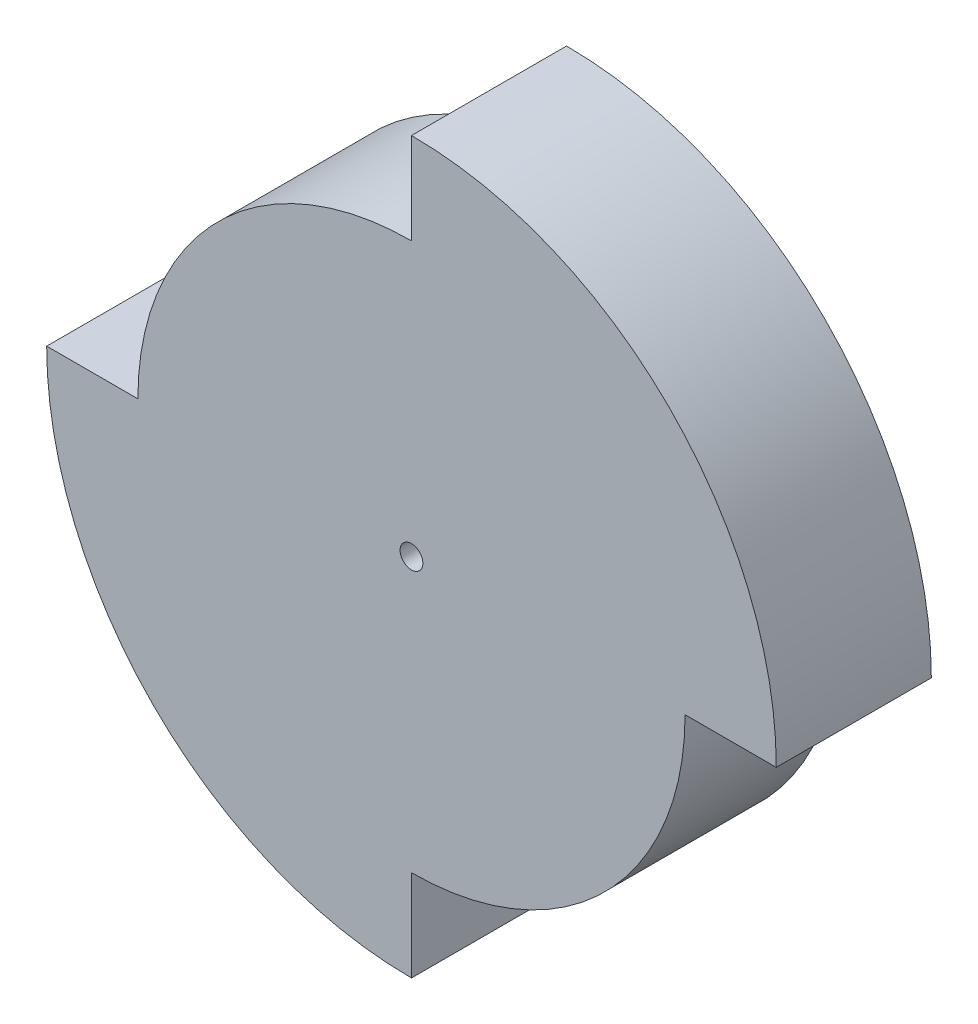
ISO-10303-21;
HEADER;
FILE_DESCRIPTION(('STEP AP214'),'2;1');
FILE_NAME('part.step','',(''),(''),'','','');
FILE_SCHEMA(('AUTOMOTIVE_DESIGN { 1 0 10303 214 1 1 1 1 }'));
ENDSEC;
DATA;
#1=APPLICATION_CONTEXT('core data for automotive mechanical design processes');
#2=APPLICATION_PROTOCOL_DEFINITION('international standard','automotive_design',2000,#1);
#3=PRODUCT_CONTEXT('',#1,'mechanical');
#4=PRODUCT('Part','Part','',(#3));
#5=PRODUCT_RELATED_PRODUCT_CATEGORY('part','',(#4));
#6=PRODUCT_DEFINITION_FORMATION('','',#4);
#7=PRODUCT_DEFINITION_CONTEXT('part definition',#1,'design');
#8=PRODUCT_DEFINITION('design','',#6,#7);
#9=PRODUCT_DEFINITION_SHAPE('','',#8);
#10=(LENGTH_UNIT() NAMED_UNIT(*) SI_UNIT(.MILLI.,.METRE.));
#11=(NAMED_UNIT(*) PLANE_ANGLE_UNIT() SI_UNIT($,.RADIAN.));
#12=(NAMED_UNIT(*) SI_UNIT($,.STERADIAN.) SOLID_ANGLE_UNIT());
#13=UNCERTAINTY_MEASURE_WITH_UNIT(LENGTH_MEASURE(1.E-05),#10,'distance_accuracy_value','');
#14=(GEOMETRIC_REPRESENTATION_CONTEXT(3) GLOBAL_UNCERTAINTY_ASSIGNED_CONTEXT((#13)) GLOBAL_UNIT_ASSIGNED_CONTEXT((#10,
#11,#12)) REPRESENTATION_CONTEXT('',''));
#15=CARTESIAN_POINT('',(0.,0.,0.));
#16=DIRECTION('',(0.,0.,1.));
#17=DIRECTION('',(1.,0.,0.));
#18=AXIS2_PLACEMENT_3D('',#15,#16,#17);
#19=CARTESIAN_POINT('',(0.,0.,17.));
#20=DIRECTION('',(0.,0.,-1.));
#21=DIRECTION('',(-1.,0.,0.));
#22=AXIS2_PLACEMENT_3D('',#19,#20,#21);
#23=CYLINDRICAL_SURFACE('',#22,30.);
#24=CARTESIAN_POINT('',(0.,0.,0.));
#25=DIRECTION('',(0.,0.,1.));
#26=DIRECTION('',(1.,0.,0.));
#27=AXIS2_PLACEMENT_3D('',#24,#25,#26);
#28=CIRCLE('',#27,30.);
#29=CARTESIAN_POINT('',(0.,30.,0.));
#30=VERTEX_POINT('',#29);
#31=CARTESIAN_POINT('',(-30.,0.,0.));
#32=VERTEX_POINT('',#31);
#33=EDGE_CURVE('E135',#30,#32,#28,.T.);
#34=ORIENTED_EDGE('',*,*,#33,.T.);
#35=DIRECTION('',(0.,0.,-1.));
#36=VECTOR('',#35,1.);
#37=CARTESIAN_POINT('',(-30.,0.,17.));
#38=LINE('',#37,#36);
#39=CARTESIAN_POINT('',(-30.,0.,17.));
#40=VERTEX_POINT('',#39);
#41=EDGE_CURVE('E11',#40,#32,#38,.T.);
#42=ORIENTED_EDGE('',*,*,#41,.F.);
#43=CARTESIAN_POINT('',(0.,0.,17.));
#44=DIRECTION('',(0.,0.,1.));
#45=DIRECTION('',(1.,0.,0.));
#46=AXIS2_PLACEMENT_3D('',#43,#44,#45);
#47=CIRCLE('',#46,30.);
#48=CARTESIAN_POINT('',(0.,30.,17.));
#49=VERTEX_POINT('',#48);
#50=EDGE_CURVE('E152',#49,#40,#47,.T.);
#51=ORIENTED_EDGE('',*,*,#50,.F.);
#52=DIRECTION('',(0.,0.,-1.));
#53=VECTOR('',#52,1.);
#54=CARTESIAN_POINT('',(0.,30.,17.));
#55=LINE('',#54,#53);
#56=EDGE_CURVE('E53',#49,#30,#55,.T.);
#57=ORIENTED_EDGE('',*,*,#56,.T.);
#58=EDGE_LOOP('',(#34,#42,#51,#57));
#59=FACE_BOUND('',#58,.T.);
#60=ADVANCED_FACE('F35',(#59),#23,.T.);
#61=CARTESIAN_POINT('',(0.,0.,17.));
#62=DIRECTION('',(0.,-1.,0.));
#63=DIRECTION('',(1.,0.,0.));
#64=AXIS2_PLACEMENT_3D('',#61,#62,#63);
#65=PLANE('',#64);
#66=DIRECTION('',(-1.,0.,0.));
#67=VECTOR('',#66,1.);
#68=CARTESIAN_POINT('',(0.,0.,0.));
#69=LINE('',#68,#67);
#70=CARTESIAN_POINT('',(-40.,0.,0.));
#71=VERTEX_POINT('',#70);
#72=EDGE_CURVE('E137',#32,#71,#69,.T.);
#73=ORIENTED_EDGE('',*,*,#72,.T.);
#74=DIRECTION('',(0.,0.,-1.));
#75=VECTOR('',#74,1.);
#76=CARTESIAN_POINT('',(-40.,0.,17.));
#77=LINE('',#76,#75);
#78=CARTESIAN_POINT('',(-40.,0.,17.));
#79=VERTEX_POINT('',#78);
#80=EDGE_CURVE('E45',#79,#71,#77,.T.);
#81=ORIENTED_EDGE('',*,*,#80,.F.);
#82=DIRECTION('',(-1.,0.,0.));
#83=VECTOR('',#82,1.);
#84=CARTESIAN_POINT('',(0.,0.,17.));
#85=LINE('',#84,#83);
#86=EDGE_CURVE('E91',#40,#79,#85,.T.);
#87=ORIENTED_EDGE('',*,*,#86,.F.);
#88=ORIENTED_EDGE('',*,*,#41,.T.);
#89=EDGE_LOOP('',(#73,#81,#87,#88));
#90=FACE_BOUND('',#89,.T.);
#91=ADVANCED_FACE('F37',(#90),#65,.F.);
#92=CARTESIAN_POINT('',(0.,0.,17.));
#93=DIRECTION('',(0.,0.,-1.));
#94=DIRECTION('',(-1.,0.,0.));
#95=AXIS2_PLACEMENT_3D('',#92,#93,#94);
#96=CYLINDRICAL_SURFACE('',#95,40.);
#97=CARTESIAN_POINT('',(0.,0.,0.));
#98=DIRECTION('',(0.,0.,1.));
#99=DIRECTION('',(1.,0.,0.));
#100=AXIS2_PLACEMENT_3D('',#97,#98,#99);
#101=CIRCLE('',#100,40.);
#102=CARTESIAN_POINT('',(0.,-40.,0.));
#103=VERTEX_POINT('',#102);
#104=EDGE_CURVE('E140',#71,#103,#101,.T.);
#105=ORIENTED_EDGE('',*,*,#104,.T.);
#106=DIRECTION('',(0.,0.,-1.));
#107=VECTOR('',#106,1.);
#108=CARTESIAN_POINT('',(0.,-40.,17.));
#109=LINE('',#108,#107);
#110=CARTESIAN_POINT('',(0.,-40.,17.));
#111=VERTEX_POINT('',#110);
#112=EDGE_CURVE('E158',#111,#103,#109,.T.);
#113=ORIENTED_EDGE('',*,*,#112,.F.);
#114=CARTESIAN_POINT('',(0.,0.,17.));
#115=DIRECTION('',(0.,0.,1.));
#116=DIRECTION('',(1.,0.,0.));
#117=AXIS2_PLACEMENT_3D('',#114,#115,#116);
#118=CIRCLE('',#117,40.);
#119=EDGE_CURVE('E166',#79,#111,#118,.T.);
#120=ORIENTED_EDGE('',*,*,#119,.F.);
#121=ORIENTED_EDGE('',*,*,#80,.T.);
#122=EDGE_LOOP('',(#105,#113,#120,#121));
#123=FACE_BOUND('',#122,.T.);
#124=ADVANCED_FACE('F164',(#123),#96,.T.);
#125=CARTESIAN_POINT('',(0.,0.,17.));
#126=DIRECTION('',(1.,0.,0.));
#127=DIRECTION('',(0.,1.,0.));
#128=AXIS2_PLACEMENT_3D('',#125,#126,#127);
#129=PLANE('',#128);
#130=DIRECTION('',(0.,-1.,0.));
#131=VECTOR('',#130,1.);
#132=CARTESIAN_POINT('',(0.,0.,0.));
#133=LINE('',#132,#131);
#134=CARTESIAN_POINT('',(0.,-30.,0.));
#135=VERTEX_POINT('',#134);
#136=EDGE_CURVE('E143',#135,#103,#133,.T.);
#137=ORIENTED_EDGE('',*,*,#136,.F.);
#138=DIRECTION('',(0.,0.,-1.));
#139=VECTOR('',#138,1.);
#140=CARTESIAN_POINT('',(0.,-30.,17.));
#141=LINE('',#140,#139);
#142=CARTESIAN_POINT('',(0.,-30.,17.));
#143=VERTEX_POINT('',#142);
#144=EDGE_CURVE('E156',#143,#135,#141,.T.);
#145=ORIENTED_EDGE('',*,*,#144,.F.);
#146=DIRECTION('',(0.,-1.,0.));
#147=VECTOR('',#146,1.);
#148=CARTESIAN_POINT('',(0.,0.,17.));
#149=LINE('',#148,#147);
#150=EDGE_CURVE('E174',#143,#111,#149,.T.);
#151=ORIENTED_EDGE('',*,*,#150,.T.);
#152=ORIENTED_EDGE('',*,*,#112,.T.);
#153=EDGE_LOOP('',(#137,#145,#151,#152));
#154=FACE_BOUND('',#153,.T.);
#155=ADVANCED_FACE('F172',(#154),#129,.T.);
#156=CARTESIAN_POINT('',(30.,0.,0.));
#157=VERTEX_POINT('',#156);
#158=EDGE_CURVE('E138',#135,#157,#28,.T.);
#159=ORIENTED_EDGE('',*,*,#158,.T.);
#160=DIRECTION('',(0.,0.,-1.));
#161=VECTOR('',#160,1.);
#162=CARTESIAN_POINT('',(30.,0.,17.));
#163=LINE('',#162,#161);
#164=CARTESIAN_POINT('',(30.,0.,17.));
#165=VERTEX_POINT('',#164);
#166=EDGE_CURVE('E127',#165,#157,#163,.T.);
#167=ORIENTED_EDGE('',*,*,#166,.F.);
#168=EDGE_CURVE('E115',#143,#165,#47,.T.);
#169=ORIENTED_EDGE('',*,*,#168,.F.);
#170=ORIENTED_EDGE('',*,*,#144,.T.);
#171=EDGE_LOOP('',(#159,#167,#169,#170));
#172=FACE_BOUND('',#171,.T.);
#173=ADVANCED_FACE('F197',(#172),#23,.T.);
#174=CARTESIAN_POINT('',(0.,0.,17.));
#175=DIRECTION('',(0.,1.,0.));
#176=DIRECTION('',(-1.,0.,0.));
#177=AXIS2_PLACEMENT_3D('',#174,#175,#176);
#178=PLANE('',#177);
#179=DIRECTION('',(1.,0.,0.));
#180=VECTOR('',#179,1.);
#181=CARTESIAN_POINT('',(0.,0.,0.));
#182=LINE('',#181,#180);
#183=CARTESIAN_POINT('',(40.,0.,0.));
#184=VERTEX_POINT('',#183);
#185=EDGE_CURVE('E124',#157,#184,#182,.T.);
#186=ORIENTED_EDGE('',*,*,#185,.T.);
#187=DIRECTION('',(0.,0.,-1.));
#188=VECTOR('',#187,1.);
#189=CARTESIAN_POINT('',(40.,0.,17.));
#190=LINE('',#189,#188);
#191=CARTESIAN_POINT('',(40.,0.,17.));
#192=VERTEX_POINT('',#191);
#193=EDGE_CURVE('E121',#192,#184,#190,.T.);
#194=ORIENTED_EDGE('',*,*,#193,.F.);
#195=DIRECTION('',(1.,0.,0.));
#196=VECTOR('',#195,1.);
#197=CARTESIAN_POINT('',(0.,0.,17.));
#198=LINE('',#197,#196);
#199=EDGE_CURVE('E107',#165,#192,#198,.T.);
#200=ORIENTED_EDGE('',*,*,#199,.F.);
#201=ORIENTED_EDGE('',*,*,#166,.T.);
#202=EDGE_LOOP('',(#186,#194,#200,#201));
#203=FACE_BOUND('',#202,.T.);
#204=ADVANCED_FACE('F122',(#203),#178,.F.);
#205=CARTESIAN_POINT('',(0.,0.,17.));
#206=DIRECTION('',(0.,0.,-1.));
#207=DIRECTION('',(-1.,0.,0.));
#208=AXIS2_PLACEMENT_3D('',#205,#206,#207);
#209=CYLINDRICAL_SURFACE('',#208,40.);
#210=CARTESIAN_POINT('',(0.,0.,0.));
#211=DIRECTION('',(0.,0.,1.));
#212=DIRECTION('',(1.,0.,0.));
#213=AXIS2_PLACEMENT_3D('',#210,#211,#212);
#214=CIRCLE('',#213,40.);
#215=CARTESIAN_POINT('',(0.,40.,0.));
#216=VERTEX_POINT('',#215);
#217=EDGE_CURVE('E147',#216,#184,#214,.F.);
#218=ORIENTED_EDGE('',*,*,#217,.F.);
#219=DIRECTION('',(0.,0.,-1.));
#220=VECTOR('',#219,1.);
#221=CARTESIAN_POINT('',(0.,40.,17.));
#222=LINE('',#221,#220);
#223=CARTESIAN_POINT('',(0.,40.,17.));
#224=VERTEX_POINT('',#223);
#225=EDGE_CURVE('E79',#224,#216,#222,.T.);
#226=ORIENTED_EDGE('',*,*,#225,.F.);
#227=CARTESIAN_POINT('',(0.,0.,17.));
#228=DIRECTION('',(0.,0.,1.));
#229=DIRECTION('',(1.,0.,0.));
#230=AXIS2_PLACEMENT_3D('',#227,#228,#229);
#231=CIRCLE('',#230,40.);
#232=EDGE_CURVE('E112',#224,#192,#231,.F.);
#233=ORIENTED_EDGE('',*,*,#232,.T.);
#234=ORIENTED_EDGE('',*,*,#193,.T.);
#235=EDGE_LOOP('',(#218,#226,#233,#234));
#236=FACE_BOUND('',#235,.T.);
#237=ADVANCED_FACE('F129',(#236),#209,.T.);
#238=CARTESIAN_POINT('',(0.,0.,17.));
#239=DIRECTION('',(-1.,0.,0.));
#240=DIRECTION('',(0.,-1.,0.));
#241=AXIS2_PLACEMENT_3D('',#238,#239,#240);
#242=PLANE('',#241);
#243=DIRECTION('',(0.,1.,0.));
#244=VECTOR('',#243,1.);
#245=CARTESIAN_POINT('',(0.,0.,0.));
#246=LINE('',#245,#244);
#247=EDGE_CURVE('E149',#30,#216,#246,.T.);
#248=ORIENTED_EDGE('',*,*,#247,.F.);
#249=ORIENTED_EDGE('',*,*,#56,.F.);
#250=DIRECTION('',(0.,1.,0.));
#251=VECTOR('',#250,1.);
#252=CARTESIAN_POINT('',(0.,0.,17.));
#253=LINE('',#252,#251);
#254=EDGE_CURVE('E130',#49,#224,#253,.T.);
#255=ORIENTED_EDGE('',*,*,#254,.T.);
#256=ORIENTED_EDGE('',*,*,#225,.T.);
#257=EDGE_LOOP('',(#248,#249,#255,#256));
#258=FACE_BOUND('',#257,.T.);
#259=ADVANCED_FACE('F209',(#258),#242,.T.);
#260=CARTESIAN_POINT('',(0.,0.,17.));
#261=DIRECTION('',(0.,0.,1.));
#262=DIRECTION('',(1.,0.,0.));
#263=AXIS2_PLACEMENT_3D('',#260,#261,#262);
#264=PLANE('',#263);
#265=CARTESIAN_POINT('',(0.,0.,17.));
#266=DIRECTION('',(0.,0.,1.));
#267=DIRECTION('',(1.,0.,0.));
#268=AXIS2_PLACEMENT_3D('',#265,#266,#267);
#269=CIRCLE('',#268,1.25);
#270=CARTESIAN_POINT('',(1.25,0.,17.));
#271=VERTEX_POINT('',#270);
#272=EDGE_CURVE('E179',#271,#271,#269,.T.);
#273=ORIENTED_EDGE('',*,*,#272,.F.);
#274=EDGE_LOOP('',(#273));
#275=FACE_BOUND('',#274,.T.);
#276=ORIENTED_EDGE('',*,*,#50,.T.);
#277=ORIENTED_EDGE('',*,*,#86,.T.);
#278=ORIENTED_EDGE('',*,*,#119,.T.);
#279=ORIENTED_EDGE('',*,*,#150,.F.);
#280=ORIENTED_EDGE('',*,*,#168,.T.);
#281=ORIENTED_EDGE('',*,*,#199,.T.);
#282=ORIENTED_EDGE('',*,*,#232,.F.);
#283=ORIENTED_EDGE('',*,*,#254,.F.);
#284=EDGE_LOOP('',(#276,#277,#278,#279,#280,#281,#282,#283));
#285=FACE_BOUND('',#284,.T.);
#286=ADVANCED_FACE('F109',(#275,#285),#264,.T.);
#287=CARTESIAN_POINT('',(0.,0.,0.));
#288=DIRECTION('',(0.,0.,1.));
#289=DIRECTION('',(1.,0.,0.));
#290=AXIS2_PLACEMENT_3D('',#287,#288,#289);
#291=PLANE('',#290);
#292=CARTESIAN_POINT('',(0.,0.,0.));
#293=DIRECTION('',(0.,0.,1.));
#294=DIRECTION('',(1.,0.,0.));
#295=AXIS2_PLACEMENT_3D('',#292,#293,#294);
#296=CIRCLE('',#295,1.25);
#297=CARTESIAN_POINT('',(1.25,0.,0.));
#298=VERTEX_POINT('',#297);
#299=EDGE_CURVE('E39',#298,#298,#296,.T.);
#300=ORIENTED_EDGE('',*,*,#299,.T.);
#301=EDGE_LOOP('',(#300));
#302=FACE_BOUND('',#301,.T.);
#303=ORIENTED_EDGE('',*,*,#33,.F.);
#304=ORIENTED_EDGE('',*,*,#247,.T.);
#305=ORIENTED_EDGE('',*,*,#217,.T.);
#306=ORIENTED_EDGE('',*,*,#185,.F.);
#307=ORIENTED_EDGE('',*,*,#158,.F.);
#308=ORIENTED_EDGE('',*,*,#136,.T.);
#309=ORIENTED_EDGE('',*,*,#104,.F.);
#310=ORIENTED_EDGE('',*,*,#72,.F.);
#311=EDGE_LOOP('',(#303,#304,#305,#306,#307,#308,#309,#310));
#312=FACE_BOUND('',#311,.T.);
#313=ADVANCED_FACE('F168',(#302,#312),#291,.F.);
#314=CARTESIAN_POINT('',(0.,0.,-83.));
#315=DIRECTION('',(0.,0.,1.));
#316=DIRECTION('',(1.,0.,0.));
#317=AXIS2_PLACEMENT_3D('',#314,#315,#316);
#318=CYLINDRICAL_SURFACE('',#317,1.25);
#319=ORIENTED_EDGE('',*,*,#272,.T.);
#320=EDGE_LOOP('',(#319));
#321=FACE_BOUND('',#320,.T.);
#322=ORIENTED_EDGE('',*,*,#299,.F.);
#323=EDGE_LOOP('',(#322));
#324=FACE_BOUND('',#323,.T.);
#325=ADVANCED_FACE('F187',(#321,#324),#318,.F.);
#326=CLOSED_SHELL('',(#60,#91,#124,#155,#173,#204,#237,#259,#286,#313,#325));
#327=MANIFOLD_SOLID_BREP('B2',#326);
#328=ADVANCED_BREP_SHAPE_REPRESENTATION('',(#18,#327),#14);
#329=SHAPE_DEFINITION_REPRESENTATION(#9,#328);
ENDSEC;
END-ISO-10303-21;
